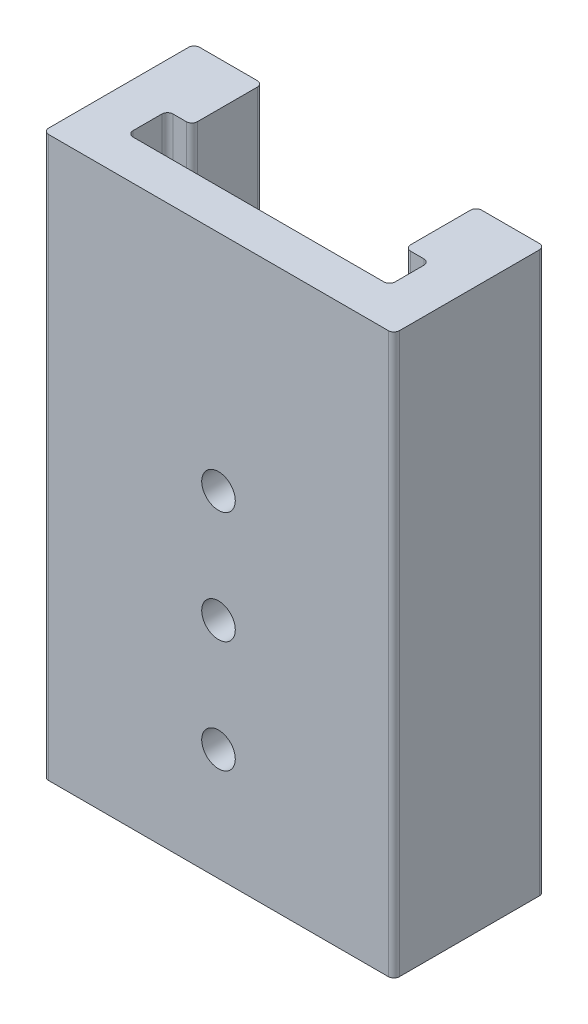
ISO-10303-21;
HEADER;
FILE_DESCRIPTION(('STEP AP214'),'2;1');
FILE_NAME('part.step','',(''),(''),'','','');
FILE_SCHEMA(('AUTOMOTIVE_DESIGN { 1 0 10303 214 1 1 1 1 }'));
ENDSEC;
DATA;
#1=APPLICATION_CONTEXT('core data for automotive mechanical design processes');
#2=APPLICATION_PROTOCOL_DEFINITION('international standard','automotive_design',2000,#1);
#3=PRODUCT_CONTEXT('',#1,'mechanical');
#4=PRODUCT('Part','Part','',(#3));
#5=PRODUCT_RELATED_PRODUCT_CATEGORY('part','',(#4));
#6=PRODUCT_DEFINITION_FORMATION('','',#4);
#7=PRODUCT_DEFINITION_CONTEXT('part definition',#1,'design');
#8=PRODUCT_DEFINITION('design','',#6,#7);
#9=PRODUCT_DEFINITION_SHAPE('','',#8);
#10=(LENGTH_UNIT() NAMED_UNIT(*) SI_UNIT(.MILLI.,.METRE.));
#11=(NAMED_UNIT(*) PLANE_ANGLE_UNIT() SI_UNIT($,.RADIAN.));
#12=(NAMED_UNIT(*) SI_UNIT($,.STERADIAN.) SOLID_ANGLE_UNIT());
#13=UNCERTAINTY_MEASURE_WITH_UNIT(LENGTH_MEASURE(1.E-05),#10,'distance_accuracy_value','');
#14=(GEOMETRIC_REPRESENTATION_CONTEXT(3) GLOBAL_UNCERTAINTY_ASSIGNED_CONTEXT((#13)) GLOBAL_UNIT_ASSIGNED_CONTEXT((#10,
#11,#12)) REPRESENTATION_CONTEXT('',''));
#15=CARTESIAN_POINT('',(0.,0.,0.));
#16=DIRECTION('',(0.,0.,1.));
#17=DIRECTION('',(1.,0.,0.));
#18=AXIS2_PLACEMENT_3D('',#15,#16,#17);
#19=CARTESIAN_POINT('',(-15.1765625,50.,-0.5));
#20=DIRECTION('',(0.,-1.,0.));
#21=DIRECTION('',(0.,0.,-1.));
#22=AXIS2_PLACEMENT_3D('',#19,#20,#21);
#23=CYLINDRICAL_SURFACE('',#22,0.5);
#24=CARTESIAN_POINT('',(-15.1765625,0.,-0.5));
#25=DIRECTION('',(0.,1.,0.));
#26=DIRECTION('',(0.,0.,1.));
#27=AXIS2_PLACEMENT_3D('',#24,#25,#26);
#28=CIRCLE('',#27,0.5);
#29=CARTESIAN_POINT('',(-15.6765625,0.,-0.500000000000004));
#30=VERTEX_POINT('',#29);
#31=CARTESIAN_POINT('',(-15.1765625,0.,0.));
#32=VERTEX_POINT('',#31);
#33=EDGE_CURVE('E228',#30,#32,#28,.T.);
#34=ORIENTED_EDGE('',*,*,#33,.T.);
#35=DIRECTION('',(0.,-1.,0.));
#36=VECTOR('',#35,1.);
#37=CARTESIAN_POINT('',(-15.1765625,50.,0.));
#38=LINE('',#37,#36);
#39=CARTESIAN_POINT('',(-15.1765625,50.,0.));
#40=VERTEX_POINT('',#39);
#41=EDGE_CURVE('E11',#40,#32,#38,.T.);
#42=ORIENTED_EDGE('',*,*,#41,.F.);
#43=CARTESIAN_POINT('',(-15.1765625,50.,-0.5));
#44=DIRECTION('',(0.,1.,0.));
#45=DIRECTION('',(0.,0.,1.));
#46=AXIS2_PLACEMENT_3D('',#43,#44,#45);
#47=CIRCLE('',#46,0.5);
#48=CARTESIAN_POINT('',(-15.6765625,50.,-0.500000000000004));
#49=VERTEX_POINT('',#48);
#50=EDGE_CURVE('E275',#49,#40,#47,.T.);
#51=ORIENTED_EDGE('',*,*,#50,.F.);
#52=DIRECTION('',(0.,-1.,0.));
#53=VECTOR('',#52,1.);
#54=CARTESIAN_POINT('',(-15.6765625,50.,-0.500000000000004));
#55=LINE('',#54,#53);
#56=EDGE_CURVE('E224',#49,#30,#55,.T.);
#57=ORIENTED_EDGE('',*,*,#56,.T.);
#58=EDGE_LOOP('',(#34,#42,#51,#57));
#59=FACE_BOUND('',#58,.T.);
#60=ADVANCED_FACE('F36',(#59),#23,.T.);
#61=CARTESIAN_POINT('',(-15.1765625,50.,0.));
#62=DIRECTION('',(0.,0.,-1.));
#63=DIRECTION('',(-1.,0.,0.));
#64=AXIS2_PLACEMENT_3D('',#61,#62,#63);
#65=PLANE('',#64);
#66=CARTESIAN_POINT('',(0.,10.,0.));
#67=DIRECTION('',(0.,0.,1.));
#68=DIRECTION('',(1.,0.,0.));
#69=AXIS2_PLACEMENT_3D('',#66,#67,#68);
#70=CIRCLE('',#69,1.5);
#71=CARTESIAN_POINT('',(1.5,10.,0.));
#72=VERTEX_POINT('',#71);
#73=EDGE_CURVE('E551',#72,#72,#70,.T.);
#74=ORIENTED_EDGE('',*,*,#73,.F.);
#75=EDGE_LOOP('',(#74));
#76=FACE_BOUND('',#75,.T.);
#77=CARTESIAN_POINT('',(0.,20.,0.));
#78=DIRECTION('',(0.,0.,1.));
#79=DIRECTION('',(1.,0.,0.));
#80=AXIS2_PLACEMENT_3D('',#77,#78,#79);
#81=CIRCLE('',#80,1.5);
#82=CARTESIAN_POINT('',(1.49999999999997,20.,0.));
#83=VERTEX_POINT('',#82);
#84=EDGE_CURVE('E558',#83,#83,#81,.T.);
#85=ORIENTED_EDGE('',*,*,#84,.F.);
#86=EDGE_LOOP('',(#85));
#87=FACE_BOUND('',#86,.T.);
#88=CARTESIAN_POINT('',(0.,30.,0.));
#89=DIRECTION('',(0.,0.,1.));
#90=DIRECTION('',(1.,0.,0.));
#91=AXIS2_PLACEMENT_3D('',#88,#89,#90);
#92=CIRCLE('',#91,1.5);
#93=CARTESIAN_POINT('',(1.49999999999993,30.,0.));
#94=VERTEX_POINT('',#93);
#95=EDGE_CURVE('E564',#94,#94,#92,.T.);
#96=ORIENTED_EDGE('',*,*,#95,.F.);
#97=EDGE_LOOP('',(#96));
#98=FACE_BOUND('',#97,.T.);
#99=DIRECTION('',(1.,0.,0.));
#100=VECTOR('',#99,1.);
#101=CARTESIAN_POINT('',(-15.1765625,0.,0.));
#102=LINE('',#101,#100);
#103=CARTESIAN_POINT('',(15.1765625,0.,0.));
#104=VERTEX_POINT('',#103);
#105=EDGE_CURVE('E231',#32,#104,#102,.T.);
#106=ORIENTED_EDGE('',*,*,#105,.T.);
#107=DIRECTION('',(0.,-1.,0.));
#108=VECTOR('',#107,1.);
#109=CARTESIAN_POINT('',(15.1765625,50.,0.));
#110=LINE('',#109,#108);
#111=CARTESIAN_POINT('',(15.1765625,50.,0.));
#112=VERTEX_POINT('',#111);
#113=EDGE_CURVE('E44',#112,#104,#110,.T.);
#114=ORIENTED_EDGE('',*,*,#113,.F.);
#115=DIRECTION('',(1.,0.,0.));
#116=VECTOR('',#115,1.);
#117=CARTESIAN_POINT('',(-15.1765625,50.,0.));
#118=LINE('',#117,#116);
#119=EDGE_CURVE('E143',#40,#112,#118,.T.);
#120=ORIENTED_EDGE('',*,*,#119,.F.);
#121=ORIENTED_EDGE('',*,*,#41,.T.);
#122=EDGE_LOOP('',(#106,#114,#120,#121));
#123=FACE_BOUND('',#122,.T.);
#124=ADVANCED_FACE('F413',(#76,#87,#98,#123),#65,.F.);
#125=CARTESIAN_POINT('',(15.1765625,50.,-0.500000000000004));
#126=DIRECTION('',(0.,-1.,0.));
#127=DIRECTION('',(0.,0.,-1.));
#128=AXIS2_PLACEMENT_3D('',#125,#126,#127);
#129=CYLINDRICAL_SURFACE('',#128,0.5);
#130=CARTESIAN_POINT('',(15.1765625,0.,-0.500000000000004));
#131=DIRECTION('',(0.,1.,0.));
#132=DIRECTION('',(0.,0.,1.));
#133=AXIS2_PLACEMENT_3D('',#130,#131,#132);
#134=CIRCLE('',#133,0.5);
#135=CARTESIAN_POINT('',(15.6765625,0.,-0.500000000000007));
#136=VERTEX_POINT('',#135);
#137=EDGE_CURVE('E234',#104,#136,#134,.T.);
#138=ORIENTED_EDGE('',*,*,#137,.T.);
#139=DIRECTION('',(0.,-1.,0.));
#140=VECTOR('',#139,1.);
#141=CARTESIAN_POINT('',(15.6765625,50.,-0.500000000000007));
#142=LINE('',#141,#140);
#143=CARTESIAN_POINT('',(15.6765625,50.,-0.500000000000007));
#144=VERTEX_POINT('',#143);
#145=EDGE_CURVE('E330',#144,#136,#142,.T.);
#146=ORIENTED_EDGE('',*,*,#145,.F.);
#147=CARTESIAN_POINT('',(15.1765625,50.,-0.500000000000004));
#148=DIRECTION('',(0.,1.,0.));
#149=DIRECTION('',(0.,0.,1.));
#150=AXIS2_PLACEMENT_3D('',#147,#148,#149);
#151=CIRCLE('',#150,0.5);
#152=EDGE_CURVE('E338',#112,#144,#151,.T.);
#153=ORIENTED_EDGE('',*,*,#152,.F.);
#154=ORIENTED_EDGE('',*,*,#113,.T.);
#155=EDGE_LOOP('',(#138,#146,#153,#154));
#156=FACE_BOUND('',#155,.T.);
#157=ADVANCED_FACE('F336',(#156),#129,.T.);
#158=CARTESIAN_POINT('',(15.6765625,50.,-0.500000000000007));
#159=DIRECTION('',(-1.,0.,0.));
#160=DIRECTION('',(0.,0.,1.));
#161=AXIS2_PLACEMENT_3D('',#158,#159,#160);
#162=PLANE('',#161);
#163=DIRECTION('',(0.,0.,-1.));
#164=VECTOR('',#163,1.);
#165=CARTESIAN_POINT('',(15.6765625,0.,-0.500000000000007));
#166=LINE('',#165,#164);
#167=CARTESIAN_POINT('',(15.6765625,0.,-12.99375));
#168=VERTEX_POINT('',#167);
#169=EDGE_CURVE('E236',#136,#168,#166,.T.);
#170=ORIENTED_EDGE('',*,*,#169,.T.);
#171=DIRECTION('',(0.,-1.,0.));
#172=VECTOR('',#171,1.);
#173=CARTESIAN_POINT('',(15.6765625,50.,-12.99375));
#174=LINE('',#173,#172);
#175=CARTESIAN_POINT('',(15.6765625,50.,-12.99375));
#176=VERTEX_POINT('',#175);
#177=EDGE_CURVE('E327',#176,#168,#174,.T.);
#178=ORIENTED_EDGE('',*,*,#177,.F.);
#179=DIRECTION('',(0.,0.,-1.));
#180=VECTOR('',#179,1.);
#181=CARTESIAN_POINT('',(15.6765625,50.,-0.500000000000007));
#182=LINE('',#181,#180);
#183=EDGE_CURVE('E356',#144,#176,#182,.T.);
#184=ORIENTED_EDGE('',*,*,#183,.F.);
#185=ORIENTED_EDGE('',*,*,#145,.T.);
#186=EDGE_LOOP('',(#170,#178,#184,#185));
#187=FACE_BOUND('',#186,.T.);
#188=ADVANCED_FACE('F347',(#187),#162,.F.);
#189=CARTESIAN_POINT('',(15.1765625,50.,-12.99375));
#190=DIRECTION('',(0.,-1.,0.));
#191=DIRECTION('',(0.,0.,-1.));
#192=AXIS2_PLACEMENT_3D('',#189,#190,#191);
#193=CYLINDRICAL_SURFACE('',#192,0.5);
#194=CARTESIAN_POINT('',(15.1765625,0.,-12.99375));
#195=DIRECTION('',(0.,1.,0.));
#196=DIRECTION('',(0.,0.,1.));
#197=AXIS2_PLACEMENT_3D('',#194,#195,#196);
#198=CIRCLE('',#197,0.5);
#199=CARTESIAN_POINT('',(15.1765625,0.,-13.49375));
#200=VERTEX_POINT('',#199);
#201=EDGE_CURVE('E238',#168,#200,#198,.T.);
#202=ORIENTED_EDGE('',*,*,#201,.T.);
#203=DIRECTION('',(0.,-1.,0.));
#204=VECTOR('',#203,1.);
#205=CARTESIAN_POINT('',(15.1765625,50.,-13.49375));
#206=LINE('',#205,#204);
#207=CARTESIAN_POINT('',(15.1765625,50.,-13.49375));
#208=VERTEX_POINT('',#207);
#209=EDGE_CURVE('E324',#208,#200,#206,.T.);
#210=ORIENTED_EDGE('',*,*,#209,.F.);
#211=CARTESIAN_POINT('',(15.1765625,50.,-12.99375));
#212=DIRECTION('',(0.,1.,0.));
#213=DIRECTION('',(0.,0.,1.));
#214=AXIS2_PLACEMENT_3D('',#211,#212,#213);
#215=CIRCLE('',#214,0.5);
#216=EDGE_CURVE('E353',#176,#208,#215,.T.);
#217=ORIENTED_EDGE('',*,*,#216,.F.);
#218=ORIENTED_EDGE('',*,*,#177,.T.);
#219=EDGE_LOOP('',(#202,#210,#217,#218));
#220=FACE_BOUND('',#219,.T.);
#221=ADVANCED_FACE('F351',(#220),#193,.T.);
#222=CARTESIAN_POINT('',(15.1765625,50.,-13.49375));
#223=DIRECTION('',(0.,0.,1.));
#224=DIRECTION('',(1.,0.,0.));
#225=AXIS2_PLACEMENT_3D('',#222,#223,#224);
#226=PLANE('',#225);
#227=DIRECTION('',(-1.,0.,0.));
#228=VECTOR('',#227,1.);
#229=CARTESIAN_POINT('',(15.1765625,0.,-13.49375));
#230=LINE('',#229,#228);
#231=CARTESIAN_POINT('',(10.025,0.,-13.49375));
#232=VERTEX_POINT('',#231);
#233=EDGE_CURVE('E240',#200,#232,#230,.T.);
#234=ORIENTED_EDGE('',*,*,#233,.T.);
#235=DIRECTION('',(0.,-1.,0.));
#236=VECTOR('',#235,1.);
#237=CARTESIAN_POINT('',(10.025,50.,-13.49375));
#238=LINE('',#237,#236);
#239=CARTESIAN_POINT('',(10.025,50.,-13.49375));
#240=VERTEX_POINT('',#239);
#241=EDGE_CURVE('E321',#240,#232,#238,.T.);
#242=ORIENTED_EDGE('',*,*,#241,.F.);
#243=DIRECTION('',(-1.,0.,0.));
#244=VECTOR('',#243,1.);
#245=CARTESIAN_POINT('',(15.1765625,50.,-13.49375));
#246=LINE('',#245,#244);
#247=EDGE_CURVE('E355',#208,#240,#246,.T.);
#248=ORIENTED_EDGE('',*,*,#247,.F.);
#249=ORIENTED_EDGE('',*,*,#209,.T.);
#250=EDGE_LOOP('',(#234,#242,#248,#249));
#251=FACE_BOUND('',#250,.T.);
#252=ADVANCED_FACE('F431',(#251),#226,.F.);
#253=CARTESIAN_POINT('',(10.025,50.,-12.99375));
#254=DIRECTION('',(0.,-1.,0.));
#255=DIRECTION('',(0.,0.,-1.));
#256=AXIS2_PLACEMENT_3D('',#253,#254,#255);
#257=CYLINDRICAL_SURFACE('',#256,0.5);
#258=CARTESIAN_POINT('',(10.025,0.,-12.99375));
#259=DIRECTION('',(0.,1.,0.));
#260=DIRECTION('',(0.,0.,1.));
#261=AXIS2_PLACEMENT_3D('',#258,#259,#260);
#262=CIRCLE('',#261,0.5);
#263=CARTESIAN_POINT('',(9.525,0.,-12.99375));
#264=VERTEX_POINT('',#263);
#265=EDGE_CURVE('E242',#232,#264,#262,.T.);
#266=ORIENTED_EDGE('',*,*,#265,.T.);
#267=DIRECTION('',(0.,-1.,0.));
#268=VECTOR('',#267,1.);
#269=CARTESIAN_POINT('',(9.525,50.,-12.99375));
#270=LINE('',#269,#268);
#271=CARTESIAN_POINT('',(9.525,50.,-12.99375));
#272=VERTEX_POINT('',#271);
#273=EDGE_CURVE('E318',#272,#264,#270,.T.);
#274=ORIENTED_EDGE('',*,*,#273,.F.);
#275=CARTESIAN_POINT('',(10.025,50.,-12.99375));
#276=DIRECTION('',(0.,1.,0.));
#277=DIRECTION('',(0.,0.,1.));
#278=AXIS2_PLACEMENT_3D('',#275,#276,#277);
#279=CIRCLE('',#278,0.5);
#280=EDGE_CURVE('E358',#240,#272,#279,.T.);
#281=ORIENTED_EDGE('',*,*,#280,.F.);
#282=ORIENTED_EDGE('',*,*,#241,.T.);
#283=EDGE_LOOP('',(#266,#274,#281,#282));
#284=FACE_BOUND('',#283,.T.);
#285=ADVANCED_FACE('F434',(#284),#257,.T.);
#286=CARTESIAN_POINT('',(9.525,50.,-12.99375));
#287=DIRECTION('',(1.,0.,0.));
#288=DIRECTION('',(0.,0.,-1.));
#289=AXIS2_PLACEMENT_3D('',#286,#287,#288);
#290=PLANE('',#289);
#291=DIRECTION('',(0.,0.,1.));
#292=VECTOR('',#291,1.);
#293=CARTESIAN_POINT('',(9.525,0.,-12.99375));
#294=LINE('',#293,#292);
#295=CARTESIAN_POINT('',(9.525,0.,-7.64375));
#296=VERTEX_POINT('',#295);
#297=EDGE_CURVE('E244',#264,#296,#294,.T.);
#298=ORIENTED_EDGE('',*,*,#297,.T.);
#299=DIRECTION('',(0.,-1.,0.));
#300=VECTOR('',#299,1.);
#301=CARTESIAN_POINT('',(9.525,50.,-7.64375));
#302=LINE('',#301,#300);
#303=CARTESIAN_POINT('',(9.525,50.,-7.64375));
#304=VERTEX_POINT('',#303);
#305=EDGE_CURVE('E315',#304,#296,#302,.T.);
#306=ORIENTED_EDGE('',*,*,#305,.F.);
#307=DIRECTION('',(0.,0.,1.));
#308=VECTOR('',#307,1.);
#309=CARTESIAN_POINT('',(9.525,50.,-12.99375));
#310=LINE('',#309,#308);
#311=EDGE_CURVE('E364',#272,#304,#310,.T.);
#312=ORIENTED_EDGE('',*,*,#311,.F.);
#313=ORIENTED_EDGE('',*,*,#273,.T.);
#314=EDGE_LOOP('',(#298,#306,#312,#313));
#315=FACE_BOUND('',#314,.T.);
#316=ADVANCED_FACE('F438',(#315),#290,.F.);
#317=CARTESIAN_POINT('',(10.025,50.,-7.64375));
#318=DIRECTION('',(0.,-1.,0.));
#319=DIRECTION('',(0.,0.,-1.));
#320=AXIS2_PLACEMENT_3D('',#317,#318,#319);
#321=CYLINDRICAL_SURFACE('',#320,0.5);
#322=CARTESIAN_POINT('',(10.025,0.,-7.64375));
#323=DIRECTION('',(0.,1.,0.));
#324=DIRECTION('',(0.,0.,1.));
#325=AXIS2_PLACEMENT_3D('',#322,#323,#324);
#326=CIRCLE('',#325,0.5);
#327=CARTESIAN_POINT('',(10.025,0.,-7.14375));
#328=VERTEX_POINT('',#327);
#329=EDGE_CURVE('E246',#296,#328,#326,.T.);
#330=ORIENTED_EDGE('',*,*,#329,.T.);
#331=DIRECTION('',(0.,-1.,0.));
#332=VECTOR('',#331,1.);
#333=CARTESIAN_POINT('',(10.025,50.,-7.14375));
#334=LINE('',#333,#332);
#335=CARTESIAN_POINT('',(10.025,50.,-7.14375));
#336=VERTEX_POINT('',#335);
#337=EDGE_CURVE('E312',#336,#328,#334,.T.);
#338=ORIENTED_EDGE('',*,*,#337,.F.);
#339=CARTESIAN_POINT('',(10.025,50.,-7.64375));
#340=DIRECTION('',(0.,1.,0.));
#341=DIRECTION('',(0.,0.,1.));
#342=AXIS2_PLACEMENT_3D('',#339,#340,#341);
#343=CIRCLE('',#342,0.5);
#344=EDGE_CURVE('E366',#304,#336,#343,.T.);
#345=ORIENTED_EDGE('',*,*,#344,.F.);
#346=ORIENTED_EDGE('',*,*,#305,.T.);
#347=EDGE_LOOP('',(#330,#338,#345,#346));
#348=FACE_BOUND('',#347,.T.);
#349=ADVANCED_FACE('F442',(#348),#321,.T.);
#350=CARTESIAN_POINT('',(10.025,50.,-7.14375));
#351=DIRECTION('',(0.,0.,-1.));
#352=DIRECTION('',(-1.,0.,0.));
#353=AXIS2_PLACEMENT_3D('',#350,#351,#352);
#354=PLANE('',#353);
#355=DIRECTION('',(1.,0.,0.));
#356=VECTOR('',#355,1.);
#357=CARTESIAN_POINT('',(10.025,0.,-7.14375));
#358=LINE('',#357,#356);
#359=CARTESIAN_POINT('',(11.2078125,0.,-7.14375));
#360=VERTEX_POINT('',#359);
#361=EDGE_CURVE('E248',#328,#360,#358,.T.);
#362=ORIENTED_EDGE('',*,*,#361,.T.);
#363=DIRECTION('',(0.,-1.,0.));
#364=VECTOR('',#363,1.);
#365=CARTESIAN_POINT('',(11.2078125,50.,-7.14375));
#366=LINE('',#365,#364);
#367=CARTESIAN_POINT('',(11.2078125,50.,-7.14375));
#368=VERTEX_POINT('',#367);
#369=EDGE_CURVE('E309',#368,#360,#366,.T.);
#370=ORIENTED_EDGE('',*,*,#369,.F.);
#371=DIRECTION('',(1.,0.,0.));
#372=VECTOR('',#371,1.);
#373=CARTESIAN_POINT('',(10.025,50.,-7.14375));
#374=LINE('',#373,#372);
#375=EDGE_CURVE('E368',#336,#368,#374,.T.);
#376=ORIENTED_EDGE('',*,*,#375,.F.);
#377=ORIENTED_EDGE('',*,*,#337,.T.);
#378=EDGE_LOOP('',(#362,#370,#376,#377));
#379=FACE_BOUND('',#378,.T.);
#380=ADVANCED_FACE('F446',(#379),#354,.F.);
#381=CARTESIAN_POINT('',(11.2078125,50.,-6.64375));
#382=DIRECTION('',(0.,-1.,0.));
#383=DIRECTION('',(0.,0.,-1.));
#384=AXIS2_PLACEMENT_3D('',#381,#382,#383);
#385=CYLINDRICAL_SURFACE('',#384,0.5);
#386=CARTESIAN_POINT('',(11.2078125,0.,-6.64375));
#387=DIRECTION('',(0.,-1.,0.));
#388=DIRECTION('',(0.,0.,-1.));
#389=AXIS2_PLACEMENT_3D('',#386,#387,#388);
#390=CIRCLE('',#389,0.5);
#391=CARTESIAN_POINT('',(11.7078125,0.,-6.64375));
#392=VERTEX_POINT('',#391);
#393=EDGE_CURVE('E250',#360,#392,#390,.T.);
#394=ORIENTED_EDGE('',*,*,#393,.T.);
#395=DIRECTION('',(0.,-1.,0.));
#396=VECTOR('',#395,1.);
#397=CARTESIAN_POINT('',(11.7078125,50.,-6.64375));
#398=LINE('',#397,#396);
#399=CARTESIAN_POINT('',(11.7078125,50.,-6.64375));
#400=VERTEX_POINT('',#399);
#401=EDGE_CURVE('E306',#400,#392,#398,.T.);
#402=ORIENTED_EDGE('',*,*,#401,.F.);
#403=CARTESIAN_POINT('',(11.2078125,50.,-6.64375));
#404=DIRECTION('',(0.,-1.,0.));
#405=DIRECTION('',(0.,0.,-1.));
#406=AXIS2_PLACEMENT_3D('',#403,#404,#405);
#407=CIRCLE('',#406,0.5);
#408=EDGE_CURVE('E370',#368,#400,#407,.T.);
#409=ORIENTED_EDGE('',*,*,#408,.F.);
#410=ORIENTED_EDGE('',*,*,#369,.T.);
#411=EDGE_LOOP('',(#394,#402,#409,#410));
#412=FACE_BOUND('',#411,.T.);
#413=ADVANCED_FACE('F450',(#412),#385,.F.);
#414=CARTESIAN_POINT('',(11.7078125,50.,-6.64375));
#415=DIRECTION('',(1.,0.,0.));
#416=DIRECTION('',(0.,0.,-1.));
#417=AXIS2_PLACEMENT_3D('',#414,#415,#416);
#418=PLANE('',#417);
#419=DIRECTION('',(0.,0.,1.));
#420=VECTOR('',#419,1.);
#421=CARTESIAN_POINT('',(11.7078125,0.,-6.64375));
#422=LINE('',#421,#420);
#423=CARTESIAN_POINT('',(11.7078125,0.,-4.071875));
#424=VERTEX_POINT('',#423);
#425=EDGE_CURVE('E252',#392,#424,#422,.T.);
#426=ORIENTED_EDGE('',*,*,#425,.T.);
#427=DIRECTION('',(0.,-1.,0.));
#428=VECTOR('',#427,1.);
#429=CARTESIAN_POINT('',(11.7078125,50.,-4.071875));
#430=LINE('',#429,#428);
#431=CARTESIAN_POINT('',(11.7078125,50.,-4.071875));
#432=VERTEX_POINT('',#431);
#433=EDGE_CURVE('E303',#432,#424,#430,.T.);
#434=ORIENTED_EDGE('',*,*,#433,.F.);
#435=DIRECTION('',(0.,0.,1.));
#436=VECTOR('',#435,1.);
#437=CARTESIAN_POINT('',(11.7078125,50.,-6.64375));
#438=LINE('',#437,#436);
#439=EDGE_CURVE('E372',#400,#432,#438,.T.);
#440=ORIENTED_EDGE('',*,*,#439,.F.);
#441=ORIENTED_EDGE('',*,*,#401,.T.);
#442=EDGE_LOOP('',(#426,#434,#440,#441));
#443=FACE_BOUND('',#442,.T.);
#444=ADVANCED_FACE('F454',(#443),#418,.F.);
#445=CARTESIAN_POINT('',(11.2078125,50.,-4.071875));
#446=DIRECTION('',(0.,-1.,0.));
#447=DIRECTION('',(0.,0.,-1.));
#448=AXIS2_PLACEMENT_3D('',#445,#446,#447);
#449=CYLINDRICAL_SURFACE('',#448,0.499999999999999);
#450=CARTESIAN_POINT('',(11.2078125,0.,-4.071875));
#451=DIRECTION('',(0.,-1.,0.));
#452=DIRECTION('',(0.,0.,-1.));
#453=AXIS2_PLACEMENT_3D('',#450,#451,#452);
#454=CIRCLE('',#453,0.499999999999999);
#455=CARTESIAN_POINT('',(11.2078125,0.,-3.571875));
#456=VERTEX_POINT('',#455);
#457=EDGE_CURVE('E254',#424,#456,#454,.T.);
#458=ORIENTED_EDGE('',*,*,#457,.T.);
#459=DIRECTION('',(0.,-1.,0.));
#460=VECTOR('',#459,1.);
#461=CARTESIAN_POINT('',(11.2078125,50.,-3.571875));
#462=LINE('',#461,#460);
#463=CARTESIAN_POINT('',(11.2078125,50.,-3.571875));
#464=VERTEX_POINT('',#463);
#465=EDGE_CURVE('E300',#464,#456,#462,.T.);
#466=ORIENTED_EDGE('',*,*,#465,.F.);
#467=CARTESIAN_POINT('',(11.2078125,50.,-4.071875));
#468=DIRECTION('',(0.,-1.,0.));
#469=DIRECTION('',(0.,0.,-1.));
#470=AXIS2_PLACEMENT_3D('',#467,#468,#469);
#471=CIRCLE('',#470,0.499999999999999);
#472=EDGE_CURVE('E374',#432,#464,#471,.T.);
#473=ORIENTED_EDGE('',*,*,#472,.F.);
#474=ORIENTED_EDGE('',*,*,#433,.T.);
#475=EDGE_LOOP('',(#458,#466,#473,#474));
#476=FACE_BOUND('',#475,.T.);
#477=ADVANCED_FACE('F458',(#476),#449,.F.);
#478=CARTESIAN_POINT('',(11.2078125,50.,-3.571875));
#479=DIRECTION('',(0.,0.,1.));
#480=DIRECTION('',(1.,0.,0.));
#481=AXIS2_PLACEMENT_3D('',#478,#479,#480);
#482=PLANE('',#481);
#483=CARTESIAN_POINT('',(0.,10.,-3.571875));
#484=DIRECTION('',(0.,0.,1.));
#485=DIRECTION('',(1.,0.,0.));
#486=AXIS2_PLACEMENT_3D('',#483,#484,#485);
#487=CIRCLE('',#486,1.5);
#488=CARTESIAN_POINT('',(1.5,10.,-3.571875));
#489=VERTEX_POINT('',#488);
#490=EDGE_CURVE('E232',#489,#489,#487,.F.);
#491=ORIENTED_EDGE('',*,*,#490,.F.);
#492=EDGE_LOOP('',(#491));
#493=FACE_BOUND('',#492,.T.);
#494=CARTESIAN_POINT('',(0.,20.,-3.571875));
#495=DIRECTION('',(0.,0.,1.));
#496=DIRECTION('',(1.,0.,0.));
#497=AXIS2_PLACEMENT_3D('',#494,#495,#496);
#498=CIRCLE('',#497,1.5);
#499=CARTESIAN_POINT('',(1.49999999999997,20.,-3.571875));
#500=VERTEX_POINT('',#499);
#501=EDGE_CURVE('E555',#500,#500,#498,.F.);
#502=ORIENTED_EDGE('',*,*,#501,.F.);
#503=EDGE_LOOP('',(#502));
#504=FACE_BOUND('',#503,.T.);
#505=CARTESIAN_POINT('',(0.,30.,-3.571875));
#506=DIRECTION('',(0.,0.,1.));
#507=DIRECTION('',(1.,0.,0.));
#508=AXIS2_PLACEMENT_3D('',#505,#506,#507);
#509=CIRCLE('',#508,1.5);
#510=CARTESIAN_POINT('',(1.49999999999993,30.,-3.571875));
#511=VERTEX_POINT('',#510);
#512=EDGE_CURVE('E561',#511,#511,#509,.F.);
#513=ORIENTED_EDGE('',*,*,#512,.F.);
#514=EDGE_LOOP('',(#513));
#515=FACE_BOUND('',#514,.T.);
#516=DIRECTION('',(-1.,0.,0.));
#517=VECTOR('',#516,1.);
#518=CARTESIAN_POINT('',(11.2078125,0.,-3.571875));
#519=LINE('',#518,#517);
#520=CARTESIAN_POINT('',(-11.2078125,0.,-3.571875));
#521=VERTEX_POINT('',#520);
#522=EDGE_CURVE('E256',#456,#521,#519,.T.);
#523=ORIENTED_EDGE('',*,*,#522,.T.);
#524=DIRECTION('',(0.,-1.,0.));
#525=VECTOR('',#524,1.);
#526=CARTESIAN_POINT('',(-11.2078125,50.,-3.571875));
#527=LINE('',#526,#525);
#528=CARTESIAN_POINT('',(-11.2078125,50.,-3.571875));
#529=VERTEX_POINT('',#528);
#530=EDGE_CURVE('E297',#529,#521,#527,.T.);
#531=ORIENTED_EDGE('',*,*,#530,.F.);
#532=DIRECTION('',(-1.,0.,0.));
#533=VECTOR('',#532,1.);
#534=CARTESIAN_POINT('',(11.2078125,50.,-3.571875));
#535=LINE('',#534,#533);
#536=EDGE_CURVE('E376',#464,#529,#535,.T.);
#537=ORIENTED_EDGE('',*,*,#536,.F.);
#538=ORIENTED_EDGE('',*,*,#465,.T.);
#539=EDGE_LOOP('',(#523,#531,#537,#538));
#540=FACE_BOUND('',#539,.T.);
#541=ADVANCED_FACE('F462',(#493,#504,#515,#540),#482,.F.);
#542=CARTESIAN_POINT('',(-11.2078125,50.,-4.071875));
#543=DIRECTION('',(0.,-1.,0.));
#544=DIRECTION('',(0.,0.,-1.));
#545=AXIS2_PLACEMENT_3D('',#542,#543,#544);
#546=CYLINDRICAL_SURFACE('',#545,0.499999999999999);
#547=CARTESIAN_POINT('',(-11.2078125,0.,-4.071875));
#548=DIRECTION('',(0.,-1.,0.));
#549=DIRECTION('',(0.,0.,1.));
#550=AXIS2_PLACEMENT_3D('',#547,#548,#549);
#551=CIRCLE('',#550,0.499999999999999);
#552=CARTESIAN_POINT('',(-11.7078125,0.,-4.071875));
#553=VERTEX_POINT('',#552);
#554=EDGE_CURVE('E258',#521,#553,#551,.T.);
#555=ORIENTED_EDGE('',*,*,#554,.T.);
#556=DIRECTION('',(0.,-1.,0.));
#557=VECTOR('',#556,1.);
#558=CARTESIAN_POINT('',(-11.7078125,50.,-4.071875));
#559=LINE('',#558,#557);
#560=CARTESIAN_POINT('',(-11.7078125,50.,-4.071875));
#561=VERTEX_POINT('',#560);
#562=EDGE_CURVE('E294',#561,#553,#559,.T.);
#563=ORIENTED_EDGE('',*,*,#562,.F.);
#564=CARTESIAN_POINT('',(-11.2078125,50.,-4.071875));
#565=DIRECTION('',(0.,-1.,0.));
#566=DIRECTION('',(0.,0.,1.));
#567=AXIS2_PLACEMENT_3D('',#564,#565,#566);
#568=CIRCLE('',#567,0.499999999999999);
#569=EDGE_CURVE('E378',#529,#561,#568,.T.);
#570=ORIENTED_EDGE('',*,*,#569,.F.);
#571=ORIENTED_EDGE('',*,*,#530,.T.);
#572=EDGE_LOOP('',(#555,#563,#570,#571));
#573=FACE_BOUND('',#572,.T.);
#574=ADVANCED_FACE('F465',(#573),#546,.F.);
#575=CARTESIAN_POINT('',(-11.7078125,50.,-6.64374999999999));
#576=DIRECTION('',(-1.,0.,0.));
#577=DIRECTION('',(0.,0.,1.));
#578=AXIS2_PLACEMENT_3D('',#575,#576,#577);
#579=PLANE('',#578);
#580=DIRECTION('',(0.,0.,-1.));
#581=VECTOR('',#580,1.);
#582=CARTESIAN_POINT('',(-11.7078125,0.,-6.64374999999999));
#583=LINE('',#582,#581);
#584=CARTESIAN_POINT('',(-11.7078125,0.,-6.64374999999999));
#585=VERTEX_POINT('',#584);
#586=EDGE_CURVE('E260',#553,#585,#583,.T.);
#587=ORIENTED_EDGE('',*,*,#586,.T.);
#588=DIRECTION('',(0.,-1.,0.));
#589=VECTOR('',#588,1.);
#590=CARTESIAN_POINT('',(-11.7078125,50.,-6.64374999999999));
#591=LINE('',#590,#589);
#592=CARTESIAN_POINT('',(-11.7078125,50.,-6.64374999999999));
#593=VERTEX_POINT('',#592);
#594=EDGE_CURVE('E291',#593,#585,#591,.T.);
#595=ORIENTED_EDGE('',*,*,#594,.F.);
#596=DIRECTION('',(0.,0.,-1.));
#597=VECTOR('',#596,1.);
#598=CARTESIAN_POINT('',(-11.7078125,50.,-6.64374999999999));
#599=LINE('',#598,#597);
#600=EDGE_CURVE('E380',#561,#593,#599,.T.);
#601=ORIENTED_EDGE('',*,*,#600,.F.);
#602=ORIENTED_EDGE('',*,*,#562,.T.);
#603=EDGE_LOOP('',(#587,#595,#601,#602));
#604=FACE_BOUND('',#603,.T.);
#605=ADVANCED_FACE('F469',(#604),#579,.F.);
#606=CARTESIAN_POINT('',(-11.2078125,50.,-6.64375));
#607=DIRECTION('',(0.,-1.,0.));
#608=DIRECTION('',(0.,0.,-1.));
#609=AXIS2_PLACEMENT_3D('',#606,#607,#608);
#610=CYLINDRICAL_SURFACE('',#609,0.5);
#611=CARTESIAN_POINT('',(-11.2078125,0.,-6.64375));
#612=DIRECTION('',(0.,-1.,0.));
#613=DIRECTION('',(0.,0.,-1.));
#614=AXIS2_PLACEMENT_3D('',#611,#612,#613);
#615=CIRCLE('',#614,0.5);
#616=CARTESIAN_POINT('',(-11.2078125,0.,-7.14375));
#617=VERTEX_POINT('',#616);
#618=EDGE_CURVE('E262',#585,#617,#615,.T.);
#619=ORIENTED_EDGE('',*,*,#618,.T.);
#620=DIRECTION('',(0.,-1.,0.));
#621=VECTOR('',#620,1.);
#622=CARTESIAN_POINT('',(-11.2078125,50.,-7.14375));
#623=LINE('',#622,#621);
#624=CARTESIAN_POINT('',(-11.2078125,50.,-7.14375));
#625=VERTEX_POINT('',#624);
#626=EDGE_CURVE('E288',#625,#617,#623,.T.);
#627=ORIENTED_EDGE('',*,*,#626,.F.);
#628=CARTESIAN_POINT('',(-11.2078125,50.,-6.64375));
#629=DIRECTION('',(0.,-1.,0.));
#630=DIRECTION('',(0.,0.,-1.));
#631=AXIS2_PLACEMENT_3D('',#628,#629,#630);
#632=CIRCLE('',#631,0.5);
#633=EDGE_CURVE('E382',#593,#625,#632,.T.);
#634=ORIENTED_EDGE('',*,*,#633,.F.);
#635=ORIENTED_EDGE('',*,*,#594,.T.);
#636=EDGE_LOOP('',(#619,#627,#634,#635));
#637=FACE_BOUND('',#636,.T.);
#638=ADVANCED_FACE('F473',(#637),#610,.F.);
#639=CARTESIAN_POINT('',(-10.025,50.,-7.14375));
#640=DIRECTION('',(0.,0.,-1.));
#641=DIRECTION('',(-1.,0.,0.));
#642=AXIS2_PLACEMENT_3D('',#639,#640,#641);
#643=PLANE('',#642);
#644=DIRECTION('',(1.,0.,0.));
#645=VECTOR('',#644,1.);
#646=CARTESIAN_POINT('',(-10.025,0.,-7.14375));
#647=LINE('',#646,#645);
#648=CARTESIAN_POINT('',(-10.025,0.,-7.14375));
#649=VERTEX_POINT('',#648);
#650=EDGE_CURVE('E264',#617,#649,#647,.T.);
#651=ORIENTED_EDGE('',*,*,#650,.T.);
#652=DIRECTION('',(0.,-1.,0.));
#653=VECTOR('',#652,1.);
#654=CARTESIAN_POINT('',(-10.025,50.,-7.14375));
#655=LINE('',#654,#653);
#656=CARTESIAN_POINT('',(-10.025,50.,-7.14375));
#657=VERTEX_POINT('',#656);
#658=EDGE_CURVE('E285',#657,#649,#655,.T.);
#659=ORIENTED_EDGE('',*,*,#658,.F.);
#660=DIRECTION('',(1.,0.,0.));
#661=VECTOR('',#660,1.);
#662=CARTESIAN_POINT('',(-10.025,50.,-7.14375));
#663=LINE('',#662,#661);
#664=EDGE_CURVE('E384',#625,#657,#663,.T.);
#665=ORIENTED_EDGE('',*,*,#664,.F.);
#666=ORIENTED_EDGE('',*,*,#626,.T.);
#667=EDGE_LOOP('',(#651,#659,#665,#666));
#668=FACE_BOUND('',#667,.T.);
#669=ADVANCED_FACE('F477',(#668),#643,.F.);
#670=CARTESIAN_POINT('',(-10.025,50.,-7.64375));
#671=DIRECTION('',(0.,-1.,0.));
#672=DIRECTION('',(0.,0.,-1.));
#673=AXIS2_PLACEMENT_3D('',#670,#671,#672);
#674=CYLINDRICAL_SURFACE('',#673,0.5);
#675=CARTESIAN_POINT('',(-10.025,0.,-7.64375));
#676=DIRECTION('',(0.,1.,0.));
#677=DIRECTION('',(0.,0.,1.));
#678=AXIS2_PLACEMENT_3D('',#675,#676,#677);
#679=CIRCLE('',#678,0.5);
#680=CARTESIAN_POINT('',(-9.525,0.,-7.64375));
#681=VERTEX_POINT('',#680);
#682=EDGE_CURVE('E266',#649,#681,#679,.T.);
#683=ORIENTED_EDGE('',*,*,#682,.T.);
#684=DIRECTION('',(0.,-1.,0.));
#685=VECTOR('',#684,1.);
#686=CARTESIAN_POINT('',(-9.525,50.,-7.64375));
#687=LINE('',#686,#685);
#688=CARTESIAN_POINT('',(-9.525,50.,-7.64375));
#689=VERTEX_POINT('',#688);
#690=EDGE_CURVE('E282',#689,#681,#687,.T.);
#691=ORIENTED_EDGE('',*,*,#690,.F.);
#692=CARTESIAN_POINT('',(-10.025,50.,-7.64375));
#693=DIRECTION('',(0.,1.,0.));
#694=DIRECTION('',(0.,0.,1.));
#695=AXIS2_PLACEMENT_3D('',#692,#693,#694);
#696=CIRCLE('',#695,0.5);
#697=EDGE_CURVE('E386',#657,#689,#696,.T.);
#698=ORIENTED_EDGE('',*,*,#697,.F.);
#699=ORIENTED_EDGE('',*,*,#658,.T.);
#700=EDGE_LOOP('',(#683,#691,#698,#699));
#701=FACE_BOUND('',#700,.T.);
#702=ADVANCED_FACE('F481',(#701),#674,.T.);
#703=CARTESIAN_POINT('',(-9.525,50.,-12.99375));
#704=DIRECTION('',(-1.,0.,0.));
#705=DIRECTION('',(0.,0.,1.));
#706=AXIS2_PLACEMENT_3D('',#703,#704,#705);
#707=PLANE('',#706);
#708=DIRECTION('',(0.,0.,-1.));
#709=VECTOR('',#708,1.);
#710=CARTESIAN_POINT('',(-9.525,0.,-12.99375));
#711=LINE('',#710,#709);
#712=CARTESIAN_POINT('',(-9.525,0.,-12.99375));
#713=VERTEX_POINT('',#712);
#714=EDGE_CURVE('E268',#681,#713,#711,.T.);
#715=ORIENTED_EDGE('',*,*,#714,.T.);
#716=DIRECTION('',(0.,-1.,0.));
#717=VECTOR('',#716,1.);
#718=CARTESIAN_POINT('',(-9.525,50.,-12.99375));
#719=LINE('',#718,#717);
#720=CARTESIAN_POINT('',(-9.525,50.,-12.99375));
#721=VERTEX_POINT('',#720);
#722=EDGE_CURVE('E279',#721,#713,#719,.T.);
#723=ORIENTED_EDGE('',*,*,#722,.F.);
#724=DIRECTION('',(0.,0.,-1.));
#725=VECTOR('',#724,1.);
#726=CARTESIAN_POINT('',(-9.525,50.,-12.99375));
#727=LINE('',#726,#725);
#728=EDGE_CURVE('E388',#689,#721,#727,.T.);
#729=ORIENTED_EDGE('',*,*,#728,.F.);
#730=ORIENTED_EDGE('',*,*,#690,.T.);
#731=EDGE_LOOP('',(#715,#723,#729,#730));
#732=FACE_BOUND('',#731,.T.);
#733=ADVANCED_FACE('F394',(#732),#707,.F.);
#734=CARTESIAN_POINT('',(-10.025,50.,-12.99375));
#735=DIRECTION('',(0.,-1.,0.));
#736=DIRECTION('',(0.,0.,-1.));
#737=AXIS2_PLACEMENT_3D('',#734,#735,#736);
#738=CYLINDRICAL_SURFACE('',#737,0.5);
#739=CARTESIAN_POINT('',(-10.025,0.,-12.99375));
#740=DIRECTION('',(0.,1.,0.));
#741=DIRECTION('',(0.,0.,1.));
#742=AXIS2_PLACEMENT_3D('',#739,#740,#741);
#743=CIRCLE('',#742,0.5);
#744=CARTESIAN_POINT('',(-10.025,0.,-13.49375));
#745=VERTEX_POINT('',#744);
#746=EDGE_CURVE('E270',#713,#745,#743,.T.);
#747=ORIENTED_EDGE('',*,*,#746,.T.);
#748=DIRECTION('',(0.,-1.,0.));
#749=VECTOR('',#748,1.);
#750=CARTESIAN_POINT('',(-10.025,50.,-13.49375));
#751=LINE('',#750,#749);
#752=CARTESIAN_POINT('',(-10.025,50.,-13.49375));
#753=VERTEX_POINT('',#752);
#754=EDGE_CURVE('E219',#753,#745,#751,.T.);
#755=ORIENTED_EDGE('',*,*,#754,.F.);
#756=CARTESIAN_POINT('',(-10.025,50.,-12.99375));
#757=DIRECTION('',(0.,1.,0.));
#758=DIRECTION('',(0.,0.,1.));
#759=AXIS2_PLACEMENT_3D('',#756,#757,#758);
#760=CIRCLE('',#759,0.5);
#761=EDGE_CURVE('E210',#721,#753,#760,.T.);
#762=ORIENTED_EDGE('',*,*,#761,.F.);
#763=ORIENTED_EDGE('',*,*,#722,.T.);
#764=EDGE_LOOP('',(#747,#755,#762,#763));
#765=FACE_BOUND('',#764,.T.);
#766=ADVANCED_FACE('F398',(#765),#738,.T.);
#767=CARTESIAN_POINT('',(-15.1765625,50.,-13.49375));
#768=DIRECTION('',(0.,0.,1.));
#769=DIRECTION('',(1.,0.,0.));
#770=AXIS2_PLACEMENT_3D('',#767,#768,#769);
#771=PLANE('',#770);
#772=DIRECTION('',(-1.,0.,0.));
#773=VECTOR('',#772,1.);
#774=CARTESIAN_POINT('',(-15.1765625,0.,-13.49375));
#775=LINE('',#774,#773);
#776=CARTESIAN_POINT('',(-15.1765625,0.,-13.49375));
#777=VERTEX_POINT('',#776);
#778=EDGE_CURVE('E218',#745,#777,#775,.T.);
#779=ORIENTED_EDGE('',*,*,#778,.T.);
#780=DIRECTION('',(0.,-1.,0.));
#781=VECTOR('',#780,1.);
#782=CARTESIAN_POINT('',(-15.1765625,50.,-13.49375));
#783=LINE('',#782,#781);
#784=CARTESIAN_POINT('',(-15.1765625,50.,-13.49375));
#785=VERTEX_POINT('',#784);
#786=EDGE_CURVE('E215',#785,#777,#783,.T.);
#787=ORIENTED_EDGE('',*,*,#786,.F.);
#788=DIRECTION('',(-1.,0.,0.));
#789=VECTOR('',#788,1.);
#790=CARTESIAN_POINT('',(-15.1765625,50.,-13.49375));
#791=LINE('',#790,#789);
#792=EDGE_CURVE('E204',#753,#785,#791,.T.);
#793=ORIENTED_EDGE('',*,*,#792,.F.);
#794=ORIENTED_EDGE('',*,*,#754,.T.);
#795=EDGE_LOOP('',(#779,#787,#793,#794));
#796=FACE_BOUND('',#795,.T.);
#797=ADVANCED_FACE('F216',(#796),#771,.F.);
#798=CARTESIAN_POINT('',(-15.1765625,50.,-12.99375));
#799=DIRECTION('',(0.,-1.,0.));
#800=DIRECTION('',(0.,0.,-1.));
#801=AXIS2_PLACEMENT_3D('',#798,#799,#800);
#802=CYLINDRICAL_SURFACE('',#801,0.5);
#803=CARTESIAN_POINT('',(-15.1765625,0.,-12.99375));
#804=DIRECTION('',(0.,1.,0.));
#805=DIRECTION('',(0.,0.,1.));
#806=AXIS2_PLACEMENT_3D('',#803,#804,#805);
#807=CIRCLE('',#806,0.5);
#808=CARTESIAN_POINT('',(-15.6765625,0.,-12.99375));
#809=VERTEX_POINT('',#808);
#810=EDGE_CURVE('E129',#777,#809,#807,.T.);
#811=ORIENTED_EDGE('',*,*,#810,.T.);
#812=DIRECTION('',(0.,-1.,0.));
#813=VECTOR('',#812,1.);
#814=CARTESIAN_POINT('',(-15.6765625,50.,-12.99375));
#815=LINE('',#814,#813);
#816=CARTESIAN_POINT('',(-15.6765625,50.,-12.99375));
#817=VERTEX_POINT('',#816);
#818=EDGE_CURVE('E220',#817,#809,#815,.T.);
#819=ORIENTED_EDGE('',*,*,#818,.F.);
#820=CARTESIAN_POINT('',(-15.1765625,50.,-12.99375));
#821=DIRECTION('',(0.,1.,0.));
#822=DIRECTION('',(0.,0.,1.));
#823=AXIS2_PLACEMENT_3D('',#820,#821,#822);
#824=CIRCLE('',#823,0.5);
#825=EDGE_CURVE('E208',#785,#817,#824,.T.);
#826=ORIENTED_EDGE('',*,*,#825,.F.);
#827=ORIENTED_EDGE('',*,*,#786,.T.);
#828=EDGE_LOOP('',(#811,#819,#826,#827));
#829=FACE_BOUND('',#828,.T.);
#830=ADVANCED_FACE('F222',(#829),#802,.T.);
#831=CARTESIAN_POINT('',(-15.6765625,50.,-0.500000000000004));
#832=DIRECTION('',(1.,0.,0.));
#833=DIRECTION('',(0.,0.,-1.));
#834=AXIS2_PLACEMENT_3D('',#831,#832,#833);
#835=PLANE('',#834);
#836=DIRECTION('',(0.,0.,1.));
#837=VECTOR('',#836,1.);
#838=CARTESIAN_POINT('',(-15.6765625,0.,-0.500000000000004));
#839=LINE('',#838,#837);
#840=EDGE_CURVE('E135',#809,#30,#839,.T.);
#841=ORIENTED_EDGE('',*,*,#840,.T.);
#842=ORIENTED_EDGE('',*,*,#56,.F.);
#843=DIRECTION('',(0.,0.,1.));
#844=VECTOR('',#843,1.);
#845=CARTESIAN_POINT('',(-15.6765625,50.,-0.500000000000004));
#846=LINE('',#845,#844);
#847=EDGE_CURVE('E52',#817,#49,#846,.T.);
#848=ORIENTED_EDGE('',*,*,#847,.F.);
#849=ORIENTED_EDGE('',*,*,#818,.T.);
#850=EDGE_LOOP('',(#841,#842,#848,#849));
#851=FACE_BOUND('',#850,.T.);
#852=ADVANCED_FACE('F402',(#851),#835,.F.);
#853=CARTESIAN_POINT('',(-15.1765625,50.,-0.5));
#854=DIRECTION('',(0.,1.,0.));
#855=DIRECTION('',(0.,0.,1.));
#856=AXIS2_PLACEMENT_3D('',#853,#854,#855);
#857=PLANE('',#856);
#858=ORIENTED_EDGE('',*,*,#50,.T.);
#859=ORIENTED_EDGE('',*,*,#119,.T.);
#860=ORIENTED_EDGE('',*,*,#152,.T.);
#861=ORIENTED_EDGE('',*,*,#183,.T.);
#862=ORIENTED_EDGE('',*,*,#216,.T.);
#863=ORIENTED_EDGE('',*,*,#247,.T.);
#864=ORIENTED_EDGE('',*,*,#280,.T.);
#865=ORIENTED_EDGE('',*,*,#311,.T.);
#866=ORIENTED_EDGE('',*,*,#344,.T.);
#867=ORIENTED_EDGE('',*,*,#375,.T.);
#868=ORIENTED_EDGE('',*,*,#408,.T.);
#869=ORIENTED_EDGE('',*,*,#439,.T.);
#870=ORIENTED_EDGE('',*,*,#472,.T.);
#871=ORIENTED_EDGE('',*,*,#536,.T.);
#872=ORIENTED_EDGE('',*,*,#569,.T.);
#873=ORIENTED_EDGE('',*,*,#600,.T.);
#874=ORIENTED_EDGE('',*,*,#633,.T.);
#875=ORIENTED_EDGE('',*,*,#664,.T.);
#876=ORIENTED_EDGE('',*,*,#697,.T.);
#877=ORIENTED_EDGE('',*,*,#728,.T.);
#878=ORIENTED_EDGE('',*,*,#761,.T.);
#879=ORIENTED_EDGE('',*,*,#792,.T.);
#880=ORIENTED_EDGE('',*,*,#825,.T.);
#881=ORIENTED_EDGE('',*,*,#847,.T.);
#882=EDGE_LOOP('',(#858,#859,#860,#861,#862,#863,#864,#865,#866,#867,#868,#869,#870,#871,#872,
#873,#874,#875,#876,#877,#878,#879,#880,#881));
#883=FACE_BOUND('',#882,.T.);
#884=ADVANCED_FACE('F206',(#883),#857,.T.);
#885=CARTESIAN_POINT('',(-15.1765625,0.,-0.5));
#886=DIRECTION('',(0.,1.,0.));
#887=DIRECTION('',(0.,0.,1.));
#888=AXIS2_PLACEMENT_3D('',#885,#886,#887);
#889=PLANE('',#888);
#890=ORIENTED_EDGE('',*,*,#33,.F.);
#891=ORIENTED_EDGE('',*,*,#840,.F.);
#892=ORIENTED_EDGE('',*,*,#810,.F.);
#893=ORIENTED_EDGE('',*,*,#778,.F.);
#894=ORIENTED_EDGE('',*,*,#746,.F.);
#895=ORIENTED_EDGE('',*,*,#714,.F.);
#896=ORIENTED_EDGE('',*,*,#682,.F.);
#897=ORIENTED_EDGE('',*,*,#650,.F.);
#898=ORIENTED_EDGE('',*,*,#618,.F.);
#899=ORIENTED_EDGE('',*,*,#586,.F.);
#900=ORIENTED_EDGE('',*,*,#554,.F.);
#901=ORIENTED_EDGE('',*,*,#522,.F.);
#902=ORIENTED_EDGE('',*,*,#457,.F.);
#903=ORIENTED_EDGE('',*,*,#425,.F.);
#904=ORIENTED_EDGE('',*,*,#393,.F.);
#905=ORIENTED_EDGE('',*,*,#361,.F.);
#906=ORIENTED_EDGE('',*,*,#329,.F.);
#907=ORIENTED_EDGE('',*,*,#297,.F.);
#908=ORIENTED_EDGE('',*,*,#265,.F.);
#909=ORIENTED_EDGE('',*,*,#233,.F.);
#910=ORIENTED_EDGE('',*,*,#201,.F.);
#911=ORIENTED_EDGE('',*,*,#169,.F.);
#912=ORIENTED_EDGE('',*,*,#137,.F.);
#913=ORIENTED_EDGE('',*,*,#105,.F.);
#914=EDGE_LOOP('',(#890,#891,#892,#893,#894,#895,#896,#897,#898,#899,#900,#901,#902,#903,#904,
#905,#906,#907,#908,#909,#910,#911,#912,#913));
#915=FACE_BOUND('',#914,.T.);
#916=ADVANCED_FACE('F342',(#915),#889,.F.);
#917=CARTESIAN_POINT('',(0.,30.,-13.49475));
#918=DIRECTION('',(0.,0.,1.));
#919=DIRECTION('',(1.,0.,0.));
#920=AXIS2_PLACEMENT_3D('',#917,#918,#919);
#921=CYLINDRICAL_SURFACE('',#920,1.5);
#922=ORIENTED_EDGE('',*,*,#95,.T.);
#923=EDGE_LOOP('',(#922));
#924=FACE_BOUND('',#923,.T.);
#925=ORIENTED_EDGE('',*,*,#512,.T.);
#926=EDGE_LOOP('',(#925));
#927=FACE_BOUND('',#926,.T.);
#928=ADVANCED_FACE('F516',(#924,#927),#921,.F.);
#929=CARTESIAN_POINT('',(0.,20.,-13.49475));
#930=DIRECTION('',(0.,0.,1.));
#931=DIRECTION('',(1.,0.,0.));
#932=AXIS2_PLACEMENT_3D('',#929,#930,#931);
#933=CYLINDRICAL_SURFACE('',#932,1.5);
#934=ORIENTED_EDGE('',*,*,#84,.T.);
#935=EDGE_LOOP('',(#934));
#936=FACE_BOUND('',#935,.T.);
#937=ORIENTED_EDGE('',*,*,#501,.T.);
#938=EDGE_LOOP('',(#937));
#939=FACE_BOUND('',#938,.T.);
#940=ADVANCED_FACE('F525',(#936,#939),#933,.F.);
#941=CARTESIAN_POINT('',(0.,10.,-13.49475));
#942=DIRECTION('',(0.,0.,1.));
#943=DIRECTION('',(1.,0.,0.));
#944=AXIS2_PLACEMENT_3D('',#941,#942,#943);
#945=CYLINDRICAL_SURFACE('',#944,1.5);
#946=ORIENTED_EDGE('',*,*,#73,.T.);
#947=EDGE_LOOP('',(#946));
#948=FACE_BOUND('',#947,.T.);
#949=ORIENTED_EDGE('',*,*,#490,.T.);
#950=EDGE_LOOP('',(#949));
#951=FACE_BOUND('',#950,.T.);
#952=ADVANCED_FACE('F532',(#948,#951),#945,.F.);
#953=CLOSED_SHELL('',(#60,#124,#157,#188,#221,#252,#285,#316,#349,#380,#413,#444,#477,#541,#574,
#605,#638,#669,#702,#733,#766,#797,#830,#852,#884,#916,#928,#940,#952));
#954=MANIFOLD_SOLID_BREP('B2',#953);
#955=ADVANCED_BREP_SHAPE_REPRESENTATION('',(#18,#954),#14);
#956=SHAPE_DEFINITION_REPRESENTATION(#9,#955);
ENDSEC;
END-ISO-10303-21;
